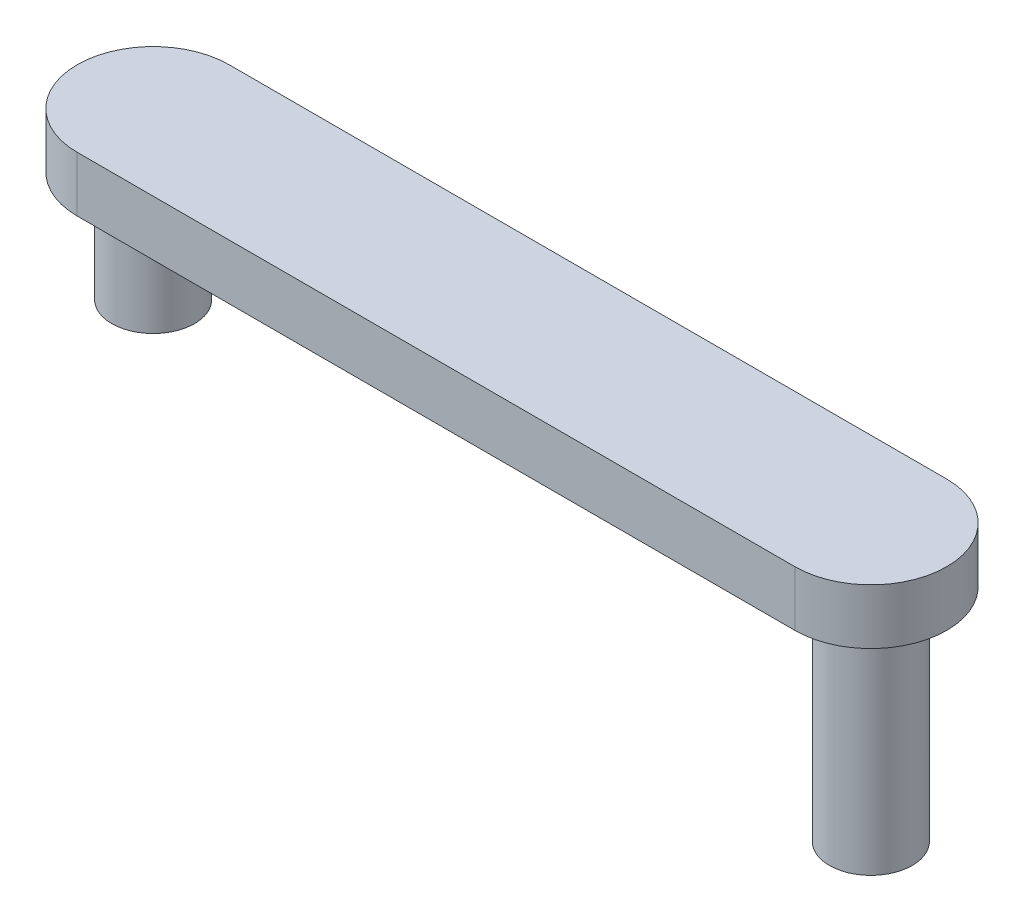
ISO-10303-21;
HEADER;
FILE_DESCRIPTION(('STEP AP214'),'2;1');
FILE_NAME('part.step','',(''),(''),'','','');
FILE_SCHEMA(('AUTOMOTIVE_DESIGN { 1 0 10303 214 1 1 1 1 }'));
ENDSEC;
DATA;
#1=APPLICATION_CONTEXT('core data for automotive mechanical design processes');
#2=APPLICATION_PROTOCOL_DEFINITION('international standard','automotive_design',2000,#1);
#3=PRODUCT_CONTEXT('',#1,'mechanical');
#4=PRODUCT('Part','Part','',(#3));
#5=PRODUCT_RELATED_PRODUCT_CATEGORY('part','',(#4));
#6=PRODUCT_DEFINITION_FORMATION('','',#4);
#7=PRODUCT_DEFINITION_CONTEXT('part definition',#1,'design');
#8=PRODUCT_DEFINITION('design','',#6,#7);
#9=PRODUCT_DEFINITION_SHAPE('','',#8);
#10=(LENGTH_UNIT() NAMED_UNIT(*) SI_UNIT(.MILLI.,.METRE.));
#11=(NAMED_UNIT(*) PLANE_ANGLE_UNIT() SI_UNIT($,.RADIAN.));
#12=(NAMED_UNIT(*) SI_UNIT($,.STERADIAN.) SOLID_ANGLE_UNIT());
#13=UNCERTAINTY_MEASURE_WITH_UNIT(LENGTH_MEASURE(1.E-05),#10,'distance_accuracy_value','');
#14=(GEOMETRIC_REPRESENTATION_CONTEXT(3) GLOBAL_UNCERTAINTY_ASSIGNED_CONTEXT((#13)) GLOBAL_UNIT_ASSIGNED_CONTEXT((#10,
#11,#12)) REPRESENTATION_CONTEXT('',''));
#15=CARTESIAN_POINT('',(0.,0.,0.));
#16=DIRECTION('',(0.,0.,1.));
#17=DIRECTION('',(1.,0.,0.));
#18=AXIS2_PLACEMENT_3D('',#15,#16,#17);
#19=CARTESIAN_POINT('',(0.,4.,0.));
#20=DIRECTION('',(0.,-1.,0.));
#21=DIRECTION('',(0.,0.,-1.));
#22=AXIS2_PLACEMENT_3D('',#19,#20,#21);
#23=CYLINDRICAL_SURFACE('',#22,1.5);
#24=CARTESIAN_POINT('',(0.,4.,0.));
#25=DIRECTION('',(0.,1.,0.));
#26=DIRECTION('',(0.,0.,1.));
#27=AXIS2_PLACEMENT_3D('',#24,#25,#26);
#28=CIRCLE('',#27,1.5);
#29=CARTESIAN_POINT('',(0.,4.,1.5));
#30=VERTEX_POINT('',#29);
#31=EDGE_CURVE('E50',#30,#30,#28,.T.);
#32=ORIENTED_EDGE('',*,*,#31,.F.);
#33=EDGE_LOOP('',(#32));
#34=FACE_BOUND('',#33,.T.);
#35=CARTESIAN_POINT('',(0.,0.,0.));
#36=DIRECTION('',(0.,1.,0.));
#37=DIRECTION('',(0.,0.,1.));
#38=AXIS2_PLACEMENT_3D('',#35,#36,#37);
#39=CIRCLE('',#38,1.5);
#40=CARTESIAN_POINT('',(0.,0.,1.5));
#41=VERTEX_POINT('',#40);
#42=EDGE_CURVE('E130',#41,#41,#39,.T.);
#43=ORIENTED_EDGE('',*,*,#42,.T.);
#44=EDGE_LOOP('',(#43));
#45=FACE_BOUND('',#44,.T.);
#46=ADVANCED_FACE('F41',(#34,#45),#23,.T.);
#47=CARTESIAN_POINT('',(0.,0.,0.));
#48=DIRECTION('',(0.,1.,0.));
#49=DIRECTION('',(0.,0.,1.));
#50=AXIS2_PLACEMENT_3D('',#47,#48,#49);
#51=PLANE('',#50);
#52=ORIENTED_EDGE('',*,*,#42,.F.);
#53=EDGE_LOOP('',(#52));
#54=FACE_BOUND('',#53,.T.);
#55=ADVANCED_FACE('F138',(#54),#51,.F.);
#56=CARTESIAN_POINT('',(0.,6.,0.));
#57=DIRECTION('',(0.,-1.,0.));
#58=DIRECTION('',(0.,0.,-1.));
#59=AXIS2_PLACEMENT_3D('',#56,#57,#58);
#60=CYLINDRICAL_SURFACE('',#59,2.75);
#61=CARTESIAN_POINT('',(0.,4.,0.));
#62=DIRECTION('',(0.,1.,0.));
#63=DIRECTION('',(0.,0.,1.));
#64=AXIS2_PLACEMENT_3D('',#61,#62,#63);
#65=CIRCLE('',#64,2.75);
#66=CARTESIAN_POINT('',(0.,4.,-2.75));
#67=VERTEX_POINT('',#66);
#68=CARTESIAN_POINT('',(0.,4.,2.75));
#69=VERTEX_POINT('',#68);
#70=EDGE_CURVE('E113',#67,#69,#65,.T.);
#71=ORIENTED_EDGE('',*,*,#70,.T.);
#72=DIRECTION('',(0.,-1.,0.));
#73=VECTOR('',#72,1.);
#74=CARTESIAN_POINT('',(0.,6.,2.75));
#75=LINE('',#74,#73);
#76=CARTESIAN_POINT('',(0.,6.,2.75));
#77=VERTEX_POINT('',#76);
#78=EDGE_CURVE('E102',#77,#69,#75,.T.);
#79=ORIENTED_EDGE('',*,*,#78,.F.);
#80=CARTESIAN_POINT('',(0.,6.,0.));
#81=DIRECTION('',(0.,1.,0.));
#82=DIRECTION('',(0.,0.,1.));
#83=AXIS2_PLACEMENT_3D('',#80,#81,#82);
#84=CIRCLE('',#83,2.75);
#85=CARTESIAN_POINT('',(0.,6.,-2.75));
#86=VERTEX_POINT('',#85);
#87=EDGE_CURVE('E94',#86,#77,#84,.T.);
#88=ORIENTED_EDGE('',*,*,#87,.F.);
#89=DIRECTION('',(0.,-1.,0.));
#90=VECTOR('',#89,1.);
#91=CARTESIAN_POINT('',(0.,6.,-2.75));
#92=LINE('',#91,#90);
#93=EDGE_CURVE('E109',#86,#67,#92,.T.);
#94=ORIENTED_EDGE('',*,*,#93,.T.);
#95=EDGE_LOOP('',(#71,#79,#88,#94));
#96=FACE_BOUND('',#95,.T.);
#97=ADVANCED_FACE('F140',(#96),#60,.T.);
#98=CARTESIAN_POINT('',(0.,6.,2.75));
#99=DIRECTION('',(0.,0.,-1.));
#100=DIRECTION('',(-1.,0.,0.));
#101=AXIS2_PLACEMENT_3D('',#98,#99,#100);
#102=PLANE('',#101);
#103=DIRECTION('',(1.,0.,0.));
#104=VECTOR('',#103,1.);
#105=CARTESIAN_POINT('',(0.,4.,2.75));
#106=LINE('',#105,#104);
#107=CARTESIAN_POINT('',(26.,4.,2.75));
#108=VERTEX_POINT('',#107);
#109=EDGE_CURVE('E100',#69,#108,#106,.T.);
#110=ORIENTED_EDGE('',*,*,#109,.T.);
#111=DIRECTION('',(0.,-1.,0.));
#112=VECTOR('',#111,1.);
#113=CARTESIAN_POINT('',(26.,6.,2.75));
#114=LINE('',#113,#112);
#115=CARTESIAN_POINT('',(26.,6.,2.75));
#116=VERTEX_POINT('',#115);
#117=EDGE_CURVE('E98',#116,#108,#114,.T.);
#118=ORIENTED_EDGE('',*,*,#117,.F.);
#119=DIRECTION('',(1.,0.,0.));
#120=VECTOR('',#119,1.);
#121=CARTESIAN_POINT('',(0.,6.,2.75));
#122=LINE('',#121,#120);
#123=EDGE_CURVE('E89',#77,#116,#122,.T.);
#124=ORIENTED_EDGE('',*,*,#123,.F.);
#125=ORIENTED_EDGE('',*,*,#78,.T.);
#126=EDGE_LOOP('',(#110,#118,#124,#125));
#127=FACE_BOUND('',#126,.T.);
#128=ADVANCED_FACE('F99',(#127),#102,.F.);
#129=CARTESIAN_POINT('',(26.,6.,0.));
#130=DIRECTION('',(0.,-1.,0.));
#131=DIRECTION('',(0.,0.,-1.));
#132=AXIS2_PLACEMENT_3D('',#129,#130,#131);
#133=CYLINDRICAL_SURFACE('',#132,2.75);
#134=CARTESIAN_POINT('',(26.,4.,0.));
#135=DIRECTION('',(0.,1.,0.));
#136=DIRECTION('',(0.,0.,1.));
#137=AXIS2_PLACEMENT_3D('',#134,#135,#136);
#138=CIRCLE('',#137,2.75);
#139=CARTESIAN_POINT('',(26.,4.,-2.75));
#140=VERTEX_POINT('',#139);
#141=EDGE_CURVE('E75',#108,#140,#138,.T.);
#142=ORIENTED_EDGE('',*,*,#141,.T.);
#143=DIRECTION('',(0.,-1.,0.));
#144=VECTOR('',#143,1.);
#145=CARTESIAN_POINT('',(26.,6.,-2.75));
#146=LINE('',#145,#144);
#147=CARTESIAN_POINT('',(26.,6.,-2.75));
#148=VERTEX_POINT('',#147);
#149=EDGE_CURVE('E103',#148,#140,#146,.T.);
#150=ORIENTED_EDGE('',*,*,#149,.F.);
#151=CARTESIAN_POINT('',(26.,6.,0.));
#152=DIRECTION('',(0.,1.,0.));
#153=DIRECTION('',(0.,0.,1.));
#154=AXIS2_PLACEMENT_3D('',#151,#152,#153);
#155=CIRCLE('',#154,2.75);
#156=EDGE_CURVE('E92',#116,#148,#155,.T.);
#157=ORIENTED_EDGE('',*,*,#156,.F.);
#158=ORIENTED_EDGE('',*,*,#117,.T.);
#159=EDGE_LOOP('',(#142,#150,#157,#158));
#160=FACE_BOUND('',#159,.T.);
#161=ADVANCED_FACE('F105',(#160),#133,.T.);
#162=CARTESIAN_POINT('',(0.,6.,-2.75));
#163=DIRECTION('',(0.,0.,1.));
#164=DIRECTION('',(1.,0.,0.));
#165=AXIS2_PLACEMENT_3D('',#162,#163,#164);
#166=PLANE('',#165);
#167=DIRECTION('',(-1.,0.,0.));
#168=VECTOR('',#167,1.);
#169=CARTESIAN_POINT('',(0.,4.,-2.75));
#170=LINE('',#169,#168);
#171=EDGE_CURVE('E81',#140,#67,#170,.T.);
#172=ORIENTED_EDGE('',*,*,#171,.T.);
#173=ORIENTED_EDGE('',*,*,#93,.F.);
#174=DIRECTION('',(-1.,0.,0.));
#175=VECTOR('',#174,1.);
#176=CARTESIAN_POINT('',(0.,6.,-2.75));
#177=LINE('',#176,#175);
#178=EDGE_CURVE('E58',#148,#86,#177,.T.);
#179=ORIENTED_EDGE('',*,*,#178,.F.);
#180=ORIENTED_EDGE('',*,*,#149,.T.);
#181=EDGE_LOOP('',(#172,#173,#179,#180));
#182=FACE_BOUND('',#181,.T.);
#183=ADVANCED_FACE('F153',(#182),#166,.F.);
#184=CARTESIAN_POINT('',(0.,6.,0.));
#185=DIRECTION('',(0.,1.,0.));
#186=DIRECTION('',(0.,0.,1.));
#187=AXIS2_PLACEMENT_3D('',#184,#185,#186);
#188=PLANE('',#187);
#189=ORIENTED_EDGE('',*,*,#87,.T.);
#190=ORIENTED_EDGE('',*,*,#123,.T.);
#191=ORIENTED_EDGE('',*,*,#156,.T.);
#192=ORIENTED_EDGE('',*,*,#178,.T.);
#193=EDGE_LOOP('',(#189,#190,#191,#192));
#194=FACE_BOUND('',#193,.T.);
#195=ADVANCED_FACE('F90',(#194),#188,.T.);
#196=CARTESIAN_POINT('',(0.,4.,0.));
#197=DIRECTION('',(0.,1.,0.));
#198=DIRECTION('',(0.,0.,1.));
#199=AXIS2_PLACEMENT_3D('',#196,#197,#198);
#200=PLANE('',#199);
#201=CARTESIAN_POINT('',(26.,4.,0.));
#202=DIRECTION('',(0.,1.,0.));
#203=DIRECTION('',(0.,0.,1.));
#204=AXIS2_PLACEMENT_3D('',#201,#202,#203);
#205=CIRCLE('',#204,1.5);
#206=CARTESIAN_POINT('',(26.,4.,1.5));
#207=VERTEX_POINT('',#206);
#208=EDGE_CURVE('E11',#207,#207,#205,.F.);
#209=ORIENTED_EDGE('',*,*,#208,.F.);
#210=EDGE_LOOP('',(#209));
#211=FACE_BOUND('',#210,.T.);
#212=ORIENTED_EDGE('',*,*,#31,.T.);
#213=EDGE_LOOP('',(#212));
#214=FACE_BOUND('',#213,.T.);
#215=ORIENTED_EDGE('',*,*,#70,.F.);
#216=ORIENTED_EDGE('',*,*,#171,.F.);
#217=ORIENTED_EDGE('',*,*,#141,.F.);
#218=ORIENTED_EDGE('',*,*,#109,.F.);
#219=EDGE_LOOP('',(#215,#216,#217,#218));
#220=FACE_BOUND('',#219,.T.);
#221=ADVANCED_FACE('F156',(#211,#214,#220),#200,.F.);
#222=CARTESIAN_POINT('',(26.,-4.,0.));
#223=DIRECTION('',(0.,1.,0.));
#224=DIRECTION('',(0.,0.,1.));
#225=AXIS2_PLACEMENT_3D('',#222,#223,#224);
#226=CYLINDRICAL_SURFACE('',#225,1.5);
#227=CARTESIAN_POINT('',(26.,-4.,0.));
#228=DIRECTION('',(0.,-1.,0.));
#229=DIRECTION('',(0.,0.,-1.));
#230=AXIS2_PLACEMENT_3D('',#227,#228,#229);
#231=CIRCLE('',#230,1.5);
#232=CARTESIAN_POINT('',(26.,-4.,-1.5));
#233=VERTEX_POINT('',#232);
#234=EDGE_CURVE('E117',#233,#233,#231,.T.);
#235=ORIENTED_EDGE('',*,*,#234,.F.);
#236=EDGE_LOOP('',(#235));
#237=FACE_BOUND('',#236,.T.);
#238=ORIENTED_EDGE('',*,*,#208,.T.);
#239=EDGE_LOOP('',(#238));
#240=FACE_BOUND('',#239,.T.);
#241=ADVANCED_FACE('F159',(#237,#240),#226,.T.);
#242=CARTESIAN_POINT('',(0.,-4.,0.));
#243=DIRECTION('',(0.,-1.,0.));
#244=DIRECTION('',(0.,0.,-1.));
#245=AXIS2_PLACEMENT_3D('',#242,#243,#244);
#246=PLANE('',#245);
#247=ORIENTED_EDGE('',*,*,#234,.T.);
#248=EDGE_LOOP('',(#247));
#249=FACE_BOUND('',#248,.T.);
#250=ADVANCED_FACE('F165',(#249),#246,.T.);
#251=CLOSED_SHELL('',(#46,#55,#97,#128,#161,#183,#195,#221,#241,#250));
#252=MANIFOLD_SOLID_BREP('B2',#251);
#253=ADVANCED_BREP_SHAPE_REPRESENTATION('',(#18,#252),#14);
#254=SHAPE_DEFINITION_REPRESENTATION(#9,#253);
ENDSEC;
END-ISO-10303-21;
